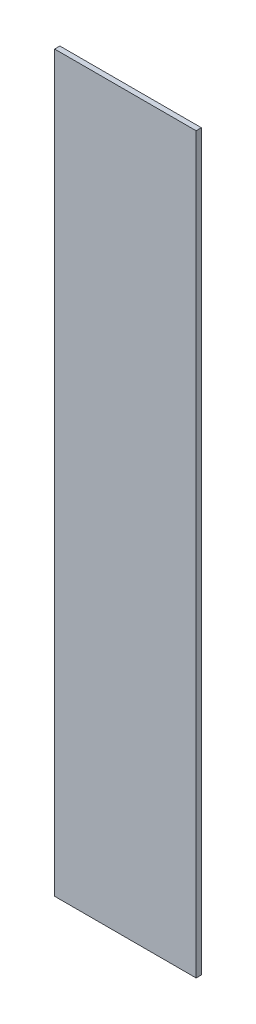
ISO-10303-21;
HEADER;
FILE_DESCRIPTION(('STEP AP214'),'2;1');
FILE_NAME('part.step','',(''),(''),'','','');
FILE_SCHEMA(('AUTOMOTIVE_DESIGN { 1 0 10303 214 1 1 1 1 }'));
ENDSEC;
DATA;
#1=APPLICATION_CONTEXT('core data for automotive mechanical design processes');
#2=APPLICATION_PROTOCOL_DEFINITION('international standard','automotive_design',2000,#1);
#3=PRODUCT_CONTEXT('',#1,'mechanical');
#4=PRODUCT('Part','Part','',(#3));
#5=PRODUCT_RELATED_PRODUCT_CATEGORY('part','',(#4));
#6=PRODUCT_DEFINITION_FORMATION('','',#4);
#7=PRODUCT_DEFINITION_CONTEXT('part definition',#1,'design');
#8=PRODUCT_DEFINITION('design','',#6,#7);
#9=PRODUCT_DEFINITION_SHAPE('','',#8);
#10=(LENGTH_UNIT() NAMED_UNIT(*) SI_UNIT(.MILLI.,.METRE.));
#11=(NAMED_UNIT(*) PLANE_ANGLE_UNIT() SI_UNIT($,.RADIAN.));
#12=(NAMED_UNIT(*) SI_UNIT($,.STERADIAN.) SOLID_ANGLE_UNIT());
#13=UNCERTAINTY_MEASURE_WITH_UNIT(LENGTH_MEASURE(1.E-05),#10,'distance_accuracy_value','');
#14=(GEOMETRIC_REPRESENTATION_CONTEXT(3) GLOBAL_UNCERTAINTY_ASSIGNED_CONTEXT((#13)) GLOBAL_UNIT_ASSIGNED_CONTEXT((#10,
#11,#12)) REPRESENTATION_CONTEXT('',''));
#15=CARTESIAN_POINT('',(0.,0.,0.));
#16=DIRECTION('',(0.,0.,1.));
#17=DIRECTION('',(1.,0.,0.));
#18=AXIS2_PLACEMENT_3D('',#15,#16,#17);
#19=CARTESIAN_POINT('',(171.45,-889.,12.7));
#20=DIRECTION('',(-1.,0.,0.));
#21=DIRECTION('',(0.,0.,1.));
#22=AXIS2_PLACEMENT_3D('',#19,#20,#21);
#23=PLANE('',#22);
#24=DIRECTION('',(0.,1.,0.));
#25=VECTOR('',#24,1.);
#26=CARTESIAN_POINT('',(171.45,-889.,0.));
#27=LINE('',#26,#25);
#28=CARTESIAN_POINT('',(171.45,-889.,0.));
#29=VERTEX_POINT('',#28);
#30=CARTESIAN_POINT('',(171.45,889.,0.));
#31=VERTEX_POINT('',#30);
#32=EDGE_CURVE('E96',#29,#31,#27,.T.);
#33=ORIENTED_EDGE('',*,*,#32,.T.);
#34=DIRECTION('',(0.,0.,-1.));
#35=VECTOR('',#34,1.);
#36=CARTESIAN_POINT('',(171.45,889.,12.7));
#37=LINE('',#36,#35);
#38=CARTESIAN_POINT('',(171.45,889.,12.7));
#39=VERTEX_POINT('',#38);
#40=EDGE_CURVE('E11',#39,#31,#37,.T.);
#41=ORIENTED_EDGE('',*,*,#40,.F.);
#42=DIRECTION('',(0.,1.,0.));
#43=VECTOR('',#42,1.);
#44=CARTESIAN_POINT('',(171.45,-889.,12.7));
#45=LINE('',#44,#43);
#46=CARTESIAN_POINT('',(171.45,-889.,12.7));
#47=VERTEX_POINT('',#46);
#48=EDGE_CURVE('E84',#47,#39,#45,.T.);
#49=ORIENTED_EDGE('',*,*,#48,.F.);
#50=DIRECTION('',(0.,0.,-1.));
#51=VECTOR('',#50,1.);
#52=CARTESIAN_POINT('',(171.45,-889.,12.7));
#53=LINE('',#52,#51);
#54=EDGE_CURVE('E92',#47,#29,#53,.T.);
#55=ORIENTED_EDGE('',*,*,#54,.T.);
#56=EDGE_LOOP('',(#33,#41,#49,#55));
#57=FACE_BOUND('',#56,.T.);
#58=ADVANCED_FACE('F33',(#57),#23,.F.);
#59=CARTESIAN_POINT('',(-171.45,889.,12.7));
#60=DIRECTION('',(0.,-1.,0.));
#61=DIRECTION('',(0.,0.,-1.));
#62=AXIS2_PLACEMENT_3D('',#59,#60,#61);
#63=PLANE('',#62);
#64=DIRECTION('',(-1.,0.,0.));
#65=VECTOR('',#64,1.);
#66=CARTESIAN_POINT('',(-171.45,889.,0.));
#67=LINE('',#66,#65);
#68=CARTESIAN_POINT('',(-171.45,889.,0.));
#69=VERTEX_POINT('',#68);
#70=EDGE_CURVE('E88',#31,#69,#67,.T.);
#71=ORIENTED_EDGE('',*,*,#70,.T.);
#72=DIRECTION('',(0.,0.,-1.));
#73=VECTOR('',#72,1.);
#74=CARTESIAN_POINT('',(-171.45,889.,12.7));
#75=LINE('',#74,#73);
#76=CARTESIAN_POINT('',(-171.45,889.,12.7));
#77=VERTEX_POINT('',#76);
#78=EDGE_CURVE('E41',#77,#69,#75,.T.);
#79=ORIENTED_EDGE('',*,*,#78,.F.);
#80=DIRECTION('',(-1.,0.,0.));
#81=VECTOR('',#80,1.);
#82=CARTESIAN_POINT('',(-171.45,889.,12.7));
#83=LINE('',#82,#81);
#84=EDGE_CURVE('E79',#39,#77,#83,.T.);
#85=ORIENTED_EDGE('',*,*,#84,.F.);
#86=ORIENTED_EDGE('',*,*,#40,.T.);
#87=EDGE_LOOP('',(#71,#79,#85,#86));
#88=FACE_BOUND('',#87,.T.);
#89=ADVANCED_FACE('F87',(#88),#63,.F.);
#90=CARTESIAN_POINT('',(-171.45,-889.,12.7));
#91=DIRECTION('',(1.,0.,0.));
#92=DIRECTION('',(0.,0.,-1.));
#93=AXIS2_PLACEMENT_3D('',#90,#91,#92);
#94=PLANE('',#93);
#95=DIRECTION('',(0.,-1.,0.));
#96=VECTOR('',#95,1.);
#97=CARTESIAN_POINT('',(-171.45,-889.,0.));
#98=LINE('',#97,#96);
#99=CARTESIAN_POINT('',(-171.45,-889.,0.));
#100=VERTEX_POINT('',#99);
#101=EDGE_CURVE('E66',#69,#100,#98,.T.);
#102=ORIENTED_EDGE('',*,*,#101,.T.);
#103=DIRECTION('',(0.,0.,-1.));
#104=VECTOR('',#103,1.);
#105=CARTESIAN_POINT('',(-171.45,-889.,12.7));
#106=LINE('',#105,#104);
#107=CARTESIAN_POINT('',(-171.45,-889.,12.7));
#108=VERTEX_POINT('',#107);
#109=EDGE_CURVE('E89',#108,#100,#106,.T.);
#110=ORIENTED_EDGE('',*,*,#109,.F.);
#111=DIRECTION('',(0.,-1.,0.));
#112=VECTOR('',#111,1.);
#113=CARTESIAN_POINT('',(-171.45,-889.,12.7));
#114=LINE('',#113,#112);
#115=EDGE_CURVE('E82',#77,#108,#114,.T.);
#116=ORIENTED_EDGE('',*,*,#115,.F.);
#117=ORIENTED_EDGE('',*,*,#78,.T.);
#118=EDGE_LOOP('',(#102,#110,#116,#117));
#119=FACE_BOUND('',#118,.T.);
#120=ADVANCED_FACE('F90',(#119),#94,.F.);
#121=CARTESIAN_POINT('',(-171.45,-889.,12.7));
#122=DIRECTION('',(0.,1.,0.));
#123=DIRECTION('',(0.,0.,1.));
#124=AXIS2_PLACEMENT_3D('',#121,#122,#123);
#125=PLANE('',#124);
#126=DIRECTION('',(1.,0.,0.));
#127=VECTOR('',#126,1.);
#128=CARTESIAN_POINT('',(-171.45,-889.,0.));
#129=LINE('',#128,#127);
#130=EDGE_CURVE('E72',#100,#29,#129,.T.);
#131=ORIENTED_EDGE('',*,*,#130,.T.);
#132=ORIENTED_EDGE('',*,*,#54,.F.);
#133=DIRECTION('',(1.,0.,0.));
#134=VECTOR('',#133,1.);
#135=CARTESIAN_POINT('',(-171.45,-889.,12.7));
#136=LINE('',#135,#134);
#137=EDGE_CURVE('E49',#108,#47,#136,.T.);
#138=ORIENTED_EDGE('',*,*,#137,.F.);
#139=ORIENTED_EDGE('',*,*,#109,.T.);
#140=EDGE_LOOP('',(#131,#132,#138,#139));
#141=FACE_BOUND('',#140,.T.);
#142=ADVANCED_FACE('F103',(#141),#125,.F.);
#143=CARTESIAN_POINT('',(0.,0.,12.7));
#144=DIRECTION('',(0.,0.,-1.));
#145=DIRECTION('',(-1.,0.,0.));
#146=AXIS2_PLACEMENT_3D('',#143,#144,#145);
#147=PLANE('',#146);
#148=ORIENTED_EDGE('',*,*,#48,.T.);
#149=ORIENTED_EDGE('',*,*,#84,.T.);
#150=ORIENTED_EDGE('',*,*,#115,.T.);
#151=ORIENTED_EDGE('',*,*,#137,.T.);
#152=EDGE_LOOP('',(#148,#149,#150,#151));
#153=FACE_BOUND('',#152,.T.);
#154=ADVANCED_FACE('F80',(#153),#147,.F.);
#155=CARTESIAN_POINT('',(0.,0.,0.));
#156=DIRECTION('',(0.,0.,-1.));
#157=DIRECTION('',(-1.,0.,0.));
#158=AXIS2_PLACEMENT_3D('',#155,#156,#157);
#159=PLANE('',#158);
#160=ORIENTED_EDGE('',*,*,#32,.F.);
#161=ORIENTED_EDGE('',*,*,#130,.F.);
#162=ORIENTED_EDGE('',*,*,#101,.F.);
#163=ORIENTED_EDGE('',*,*,#70,.F.);
#164=EDGE_LOOP('',(#160,#161,#162,#163));
#165=FACE_BOUND('',#164,.T.);
#166=ADVANCED_FACE('F106',(#165),#159,.T.);
#167=CLOSED_SHELL('',(#58,#89,#120,#142,#154,#166));
#168=MANIFOLD_SOLID_BREP('B2',#167);
#169=ADVANCED_BREP_SHAPE_REPRESENTATION('',(#18,#168),#14);
#170=SHAPE_DEFINITION_REPRESENTATION(#9,#169);
ENDSEC;
END-ISO-10303-21;
